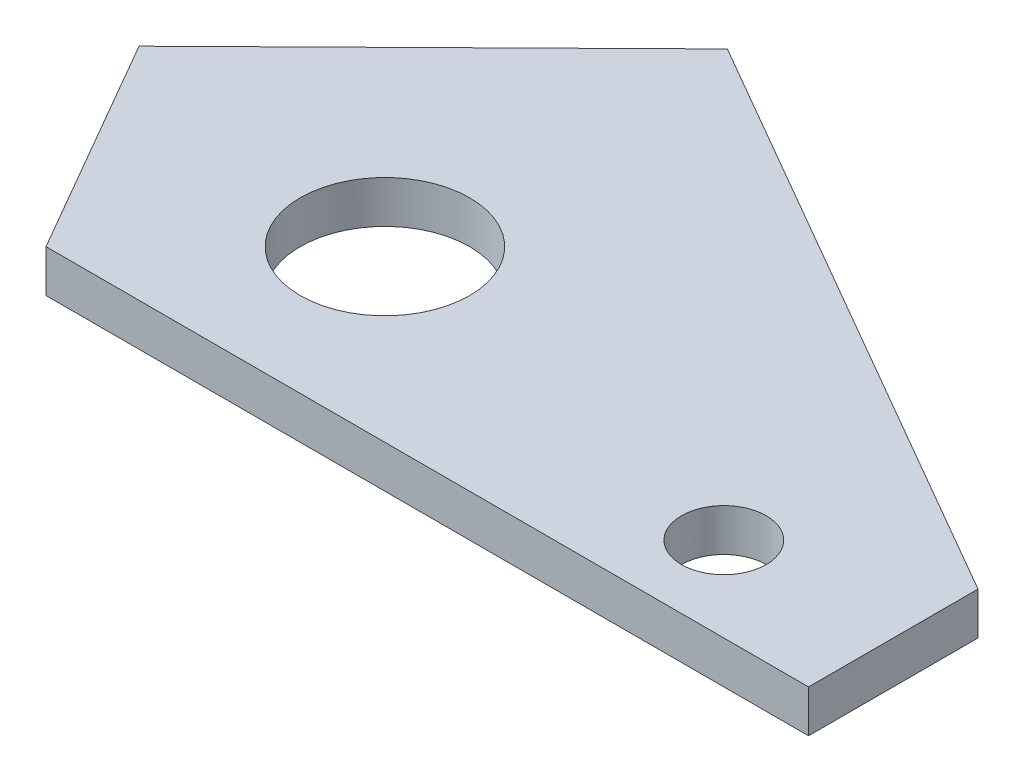
ISO-10303-21;
HEADER;
FILE_DESCRIPTION(('STEP AP214'),'2;1');
FILE_NAME('part.step','',(''),(''),'','','');
FILE_SCHEMA(('AUTOMOTIVE_DESIGN { 1 0 10303 214 1 1 1 1 }'));
ENDSEC;
DATA;
#1=APPLICATION_CONTEXT('core data for automotive mechanical design processes');
#2=APPLICATION_PROTOCOL_DEFINITION('international standard','automotive_design',2000,#1);
#3=PRODUCT_CONTEXT('',#1,'mechanical');
#4=PRODUCT('Part','Part','',(#3));
#5=PRODUCT_RELATED_PRODUCT_CATEGORY('part','',(#4));
#6=PRODUCT_DEFINITION_FORMATION('','',#4);
#7=PRODUCT_DEFINITION_CONTEXT('part definition',#1,'design');
#8=PRODUCT_DEFINITION('design','',#6,#7);
#9=PRODUCT_DEFINITION_SHAPE('','',#8);
#10=(LENGTH_UNIT() NAMED_UNIT(*) SI_UNIT(.MILLI.,.METRE.));
#11=(NAMED_UNIT(*) PLANE_ANGLE_UNIT() SI_UNIT($,.RADIAN.));
#12=(NAMED_UNIT(*) SI_UNIT($,.STERADIAN.) SOLID_ANGLE_UNIT());
#13=UNCERTAINTY_MEASURE_WITH_UNIT(LENGTH_MEASURE(1.E-05),#10,'distance_accuracy_value','');
#14=(GEOMETRIC_REPRESENTATION_CONTEXT(3) GLOBAL_UNCERTAINTY_ASSIGNED_CONTEXT((#13)) GLOBAL_UNIT_ASSIGNED_CONTEXT((#10,
#11,#12)) REPRESENTATION_CONTEXT('',''));
#15=CARTESIAN_POINT('',(0.,0.,0.));
#16=DIRECTION('',(0.,0.,1.));
#17=DIRECTION('',(1.,0.,0.));
#18=AXIS2_PLACEMENT_3D('',#15,#16,#17);
#19=CARTESIAN_POINT('',(-85.7249999999998,6.35,49.4933518262808));
#20=DIRECTION('',(-0.866025403784438,0.,0.500000000000001));
#21=DIRECTION('',(0.500000000000002,0.,0.866025403784438));
#22=AXIS2_PLACEMENT_3D('',#19,#20,#21);
#23=PLANE('',#22);
#24=DIRECTION('',(-0.500000000000001,0.,-0.866025403784438));
#25=VECTOR('',#24,1.);
#26=CARTESIAN_POINT('',(-85.7249999999998,0.,49.4933518262808));
#27=LINE('',#26,#25);
#28=CARTESIAN_POINT('',(-114.3,0.,0.));
#29=VERTEX_POINT('',#28);
#30=CARTESIAN_POINT('',(-133.35,0.,-32.9955678841871));
#31=VERTEX_POINT('',#30);
#32=EDGE_CURVE('E108',#29,#31,#27,.T.);
#33=ORIENTED_EDGE('',*,*,#32,.F.);
#34=DIRECTION('',(0.,-1.,0.));
#35=VECTOR('',#34,1.);
#36=CARTESIAN_POINT('',(-114.3,6.35,0.));
#37=LINE('',#36,#35);
#38=CARTESIAN_POINT('',(-114.3,6.35,0.));
#39=VERTEX_POINT('',#38);
#40=EDGE_CURVE('E11',#39,#29,#37,.T.);
#41=ORIENTED_EDGE('',*,*,#40,.F.);
#42=DIRECTION('',(-0.500000000000001,0.,-0.866025403784438));
#43=VECTOR('',#42,1.);
#44=CARTESIAN_POINT('',(-85.7249999999998,6.35,49.4933518262808));
#45=LINE('',#44,#43);
#46=CARTESIAN_POINT('',(-133.35,6.35,-32.9955678841871));
#47=VERTEX_POINT('',#46);
#48=EDGE_CURVE('E120',#39,#47,#45,.T.);
#49=ORIENTED_EDGE('',*,*,#48,.T.);
#50=DIRECTION('',(0.,-1.,0.));
#51=VECTOR('',#50,1.);
#52=CARTESIAN_POINT('',(-133.35,6.35,-32.9955678841871));
#53=LINE('',#52,#51);
#54=EDGE_CURVE('E51',#47,#31,#53,.T.);
#55=ORIENTED_EDGE('',*,*,#54,.T.);
#56=EDGE_LOOP('',(#33,#41,#49,#55));
#57=FACE_BOUND('',#56,.T.);
#58=ADVANCED_FACE('F35',(#57),#23,.T.);
#59=CARTESIAN_POINT('',(0.,6.35,0.));
#60=DIRECTION('',(0.,0.,1.));
#61=DIRECTION('',(1.,0.,0.));
#62=AXIS2_PLACEMENT_3D('',#59,#60,#61);
#63=PLANE('',#62);
#64=DIRECTION('',(-1.,0.,0.));
#65=VECTOR('',#64,1.);
#66=CARTESIAN_POINT('',(0.,0.,0.));
#67=LINE('',#66,#65);
#68=CARTESIAN_POINT('',(0.,0.,0.));
#69=VERTEX_POINT('',#68);
#70=EDGE_CURVE('E110',#69,#29,#67,.T.);
#71=ORIENTED_EDGE('',*,*,#70,.F.);
#72=DIRECTION('',(0.,-1.,0.));
#73=VECTOR('',#72,1.);
#74=CARTESIAN_POINT('',(0.,6.35,0.));
#75=LINE('',#74,#73);
#76=CARTESIAN_POINT('',(0.,6.35,0.));
#77=VERTEX_POINT('',#76);
#78=EDGE_CURVE('E43',#77,#69,#75,.T.);
#79=ORIENTED_EDGE('',*,*,#78,.F.);
#80=DIRECTION('',(-1.,0.,0.));
#81=VECTOR('',#80,1.);
#82=CARTESIAN_POINT('',(0.,6.35,0.));
#83=LINE('',#82,#81);
#84=EDGE_CURVE('E91',#77,#39,#83,.T.);
#85=ORIENTED_EDGE('',*,*,#84,.T.);
#86=ORIENTED_EDGE('',*,*,#40,.T.);
#87=EDGE_LOOP('',(#71,#79,#85,#86));
#88=FACE_BOUND('',#87,.T.);
#89=ADVANCED_FACE('F126',(#88),#63,.T.);
#90=CARTESIAN_POINT('',(0.,6.35,0.));
#91=DIRECTION('',(-1.,0.,0.));
#92=DIRECTION('',(0.,0.,1.));
#93=AXIS2_PLACEMENT_3D('',#90,#91,#92);
#94=PLANE('',#93);
#95=DIRECTION('',(0.,0.,-1.));
#96=VECTOR('',#95,1.);
#97=CARTESIAN_POINT('',(0.,0.,0.));
#98=LINE('',#97,#96);
#99=CARTESIAN_POINT('',(0.,0.,-25.4));
#100=VERTEX_POINT('',#99);
#101=EDGE_CURVE('E98',#69,#100,#98,.T.);
#102=ORIENTED_EDGE('',*,*,#101,.T.);
#103=DIRECTION('',(0.,-1.,0.));
#104=VECTOR('',#103,1.);
#105=CARTESIAN_POINT('',(0.,6.35,-25.4));
#106=LINE('',#105,#104);
#107=CARTESIAN_POINT('',(0.,6.35,-25.4));
#108=VERTEX_POINT('',#107);
#109=EDGE_CURVE('E95',#108,#100,#106,.T.);
#110=ORIENTED_EDGE('',*,*,#109,.F.);
#111=DIRECTION('',(0.,0.,-1.));
#112=VECTOR('',#111,1.);
#113=CARTESIAN_POINT('',(0.,6.35,0.));
#114=LINE('',#113,#112);
#115=EDGE_CURVE('E84',#77,#108,#114,.T.);
#116=ORIENTED_EDGE('',*,*,#115,.F.);
#117=ORIENTED_EDGE('',*,*,#78,.T.);
#118=EDGE_LOOP('',(#102,#110,#116,#117));
#119=FACE_BOUND('',#118,.T.);
#120=ADVANCED_FACE('F96',(#119),#94,.F.);
#121=CARTESIAN_POINT('',(10.9985226280623,6.35,-19.0500000000001));
#122=DIRECTION('',(0.499999999999995,0.,-0.866025403784442));
#123=DIRECTION('',(-0.866025403784442,0.,-0.499999999999995));
#124=AXIS2_PLACEMENT_3D('',#121,#122,#123);
#125=PLANE('',#124);
#126=DIRECTION('',(0.866025403784442,0.,0.499999999999995));
#127=VECTOR('',#126,1.);
#128=CARTESIAN_POINT('',(10.9985226280623,0.,-19.0500000000001));
#129=LINE('',#128,#127);
#130=CARTESIAN_POINT('',(-88.9,0.,-76.726438930957));
#131=VERTEX_POINT('',#130);
#132=EDGE_CURVE('E115',#131,#100,#129,.T.);
#133=ORIENTED_EDGE('',*,*,#132,.F.);
#134=DIRECTION('',(0.,-1.,0.));
#135=VECTOR('',#134,1.);
#136=CARTESIAN_POINT('',(-88.9,6.35,-76.726438930957));
#137=LINE('',#136,#135);
#138=CARTESIAN_POINT('',(-88.9,6.35,-76.726438930957));
#139=VERTEX_POINT('',#138);
#140=EDGE_CURVE('E67',#139,#131,#137,.T.);
#141=ORIENTED_EDGE('',*,*,#140,.F.);
#142=DIRECTION('',(0.866025403784442,0.,0.499999999999995));
#143=VECTOR('',#142,1.);
#144=CARTESIAN_POINT('',(10.9985226280623,6.35,-19.0500000000001));
#145=LINE('',#144,#143);
#146=EDGE_CURVE('E89',#139,#108,#145,.T.);
#147=ORIENTED_EDGE('',*,*,#146,.T.);
#148=ORIENTED_EDGE('',*,*,#109,.T.);
#149=EDGE_LOOP('',(#133,#141,#147,#148));
#150=FACE_BOUND('',#149,.T.);
#151=ADVANCED_FACE('F102',(#150),#125,.T.);
#152=CARTESIAN_POINT('',(-82.0831716398919,6.35,-83.4329820572529));
#153=DIRECTION('',(-0.701316892809531,0.,-0.712849644637623));
#154=DIRECTION('',(-0.712849644637623,0.,0.701316892809531));
#155=AXIS2_PLACEMENT_3D('',#152,#153,#154);
#156=PLANE('',#155);
#157=DIRECTION('',(0.712849644637623,0.,-0.701316892809531));
#158=VECTOR('',#157,1.);
#159=CARTESIAN_POINT('',(-82.0831716398919,0.,-83.4329820572529));
#160=LINE('',#159,#158);
#161=EDGE_CURVE('E117',#31,#131,#160,.T.);
#162=ORIENTED_EDGE('',*,*,#161,.F.);
#163=ORIENTED_EDGE('',*,*,#54,.F.);
#164=DIRECTION('',(0.712849644637623,0.,-0.701316892809531));
#165=VECTOR('',#164,1.);
#166=CARTESIAN_POINT('',(-82.0831716398919,6.35,-83.4329820572529));
#167=LINE('',#166,#165);
#168=EDGE_CURVE('E103',#47,#139,#167,.T.);
#169=ORIENTED_EDGE('',*,*,#168,.T.);
#170=ORIENTED_EDGE('',*,*,#140,.T.);
#171=EDGE_LOOP('',(#162,#163,#169,#170));
#172=FACE_BOUND('',#171,.T.);
#173=ADVANCED_FACE('F127',(#172),#156,.T.);
#174=CARTESIAN_POINT('',(0.,6.35,0.));
#175=DIRECTION('',(0.,1.,0.));
#176=DIRECTION('',(0.,0.,1.));
#177=AXIS2_PLACEMENT_3D('',#174,#175,#176);
#178=PLANE('',#177);
#179=CARTESIAN_POINT('',(-88.9,6.35,-25.4));
#180=DIRECTION('',(0.,1.,0.));
#181=DIRECTION('',(0.,0.,1.));
#182=AXIS2_PLACEMENT_3D('',#179,#180,#181);
#183=CIRCLE('',#182,12.7);
#184=CARTESIAN_POINT('',(-88.9,6.35,-12.7));
#185=VERTEX_POINT('',#184);
#186=EDGE_CURVE('E199',#185,#185,#183,.F.);
#187=ORIENTED_EDGE('',*,*,#186,.T.);
#188=EDGE_LOOP('',(#187));
#189=FACE_BOUND('',#188,.T.);
#190=CARTESIAN_POINT('',(-25.4,6.35,-12.7));
#191=DIRECTION('',(0.,1.,0.));
#192=DIRECTION('',(0.,0.,1.));
#193=AXIS2_PLACEMENT_3D('',#190,#191,#192);
#194=CIRCLE('',#193,6.35);
#195=CARTESIAN_POINT('',(-25.4,6.35,-6.35));
#196=VERTEX_POINT('',#195);
#197=EDGE_CURVE('E208',#196,#196,#194,.F.);
#198=ORIENTED_EDGE('',*,*,#197,.T.);
#199=EDGE_LOOP('',(#198));
#200=FACE_BOUND('',#199,.T.);
#201=ORIENTED_EDGE('',*,*,#48,.F.);
#202=ORIENTED_EDGE('',*,*,#84,.F.);
#203=ORIENTED_EDGE('',*,*,#115,.T.);
#204=ORIENTED_EDGE('',*,*,#146,.F.);
#205=ORIENTED_EDGE('',*,*,#168,.F.);
#206=EDGE_LOOP('',(#201,#202,#203,#204,#205));
#207=FACE_BOUND('',#206,.T.);
#208=ADVANCED_FACE('F86',(#189,#200,#207),#178,.T.);
#209=CARTESIAN_POINT('',(0.,0.,0.));
#210=DIRECTION('',(0.,1.,0.));
#211=DIRECTION('',(0.,0.,1.));
#212=AXIS2_PLACEMENT_3D('',#209,#210,#211);
#213=PLANE('',#212);
#214=CARTESIAN_POINT('',(-88.9,0.,-25.4));
#215=DIRECTION('',(0.,-1.,0.));
#216=DIRECTION('',(0.,0.,-1.));
#217=AXIS2_PLACEMENT_3D('',#214,#215,#216);
#218=CIRCLE('',#217,12.7);
#219=CARTESIAN_POINT('',(-88.9,0.,-38.1));
#220=VERTEX_POINT('',#219);
#221=EDGE_CURVE('E111',#220,#220,#218,.T.);
#222=ORIENTED_EDGE('',*,*,#221,.F.);
#223=EDGE_LOOP('',(#222));
#224=FACE_BOUND('',#223,.T.);
#225=CARTESIAN_POINT('',(-25.4,0.,-12.7));
#226=DIRECTION('',(0.,-1.,0.));
#227=DIRECTION('',(0.,0.,-1.));
#228=AXIS2_PLACEMENT_3D('',#225,#226,#227);
#229=CIRCLE('',#228,6.35);
#230=CARTESIAN_POINT('',(-25.4,0.,-19.05));
#231=VERTEX_POINT('',#230);
#232=EDGE_CURVE('E203',#231,#231,#229,.T.);
#233=ORIENTED_EDGE('',*,*,#232,.F.);
#234=EDGE_LOOP('',(#233));
#235=FACE_BOUND('',#234,.T.);
#236=ORIENTED_EDGE('',*,*,#32,.T.);
#237=ORIENTED_EDGE('',*,*,#161,.T.);
#238=ORIENTED_EDGE('',*,*,#132,.T.);
#239=ORIENTED_EDGE('',*,*,#101,.F.);
#240=ORIENTED_EDGE('',*,*,#70,.T.);
#241=EDGE_LOOP('',(#236,#237,#238,#239,#240));
#242=FACE_BOUND('',#241,.T.);
#243=ADVANCED_FACE('F125',(#224,#235,#242),#213,.F.);
#244=CARTESIAN_POINT('',(-25.4,6.351,-12.7));
#245=DIRECTION('',(0.,-1.,0.));
#246=DIRECTION('',(0.,0.,-1.));
#247=AXIS2_PLACEMENT_3D('',#244,#245,#246);
#248=CYLINDRICAL_SURFACE('',#247,6.35);
#249=ORIENTED_EDGE('',*,*,#197,.F.);
#250=EDGE_LOOP('',(#249));
#251=FACE_BOUND('',#250,.T.);
#252=ORIENTED_EDGE('',*,*,#232,.T.);
#253=EDGE_LOOP('',(#252));
#254=FACE_BOUND('',#253,.T.);
#255=ADVANCED_FACE('F173',(#251,#254),#248,.F.);
#256=CARTESIAN_POINT('',(-88.9,6.351,-25.4));
#257=DIRECTION('',(0.,-1.,0.));
#258=DIRECTION('',(0.,0.,-1.));
#259=AXIS2_PLACEMENT_3D('',#256,#257,#258);
#260=CYLINDRICAL_SURFACE('',#259,12.7);
#261=ORIENTED_EDGE('',*,*,#186,.F.);
#262=EDGE_LOOP('',(#261));
#263=FACE_BOUND('',#262,.T.);
#264=ORIENTED_EDGE('',*,*,#221,.T.);
#265=EDGE_LOOP('',(#264));
#266=FACE_BOUND('',#265,.T.);
#267=ADVANCED_FACE('F182',(#263,#266),#260,.F.);
#268=CLOSED_SHELL('',(#58,#89,#120,#151,#173,#208,#243,#255,#267));
#269=MANIFOLD_SOLID_BREP('B2',#268);
#270=ADVANCED_BREP_SHAPE_REPRESENTATION('',(#18,#269),#14);
#271=SHAPE_DEFINITION_REPRESENTATION(#9,#270);
ENDSEC;
END-ISO-10303-21;
